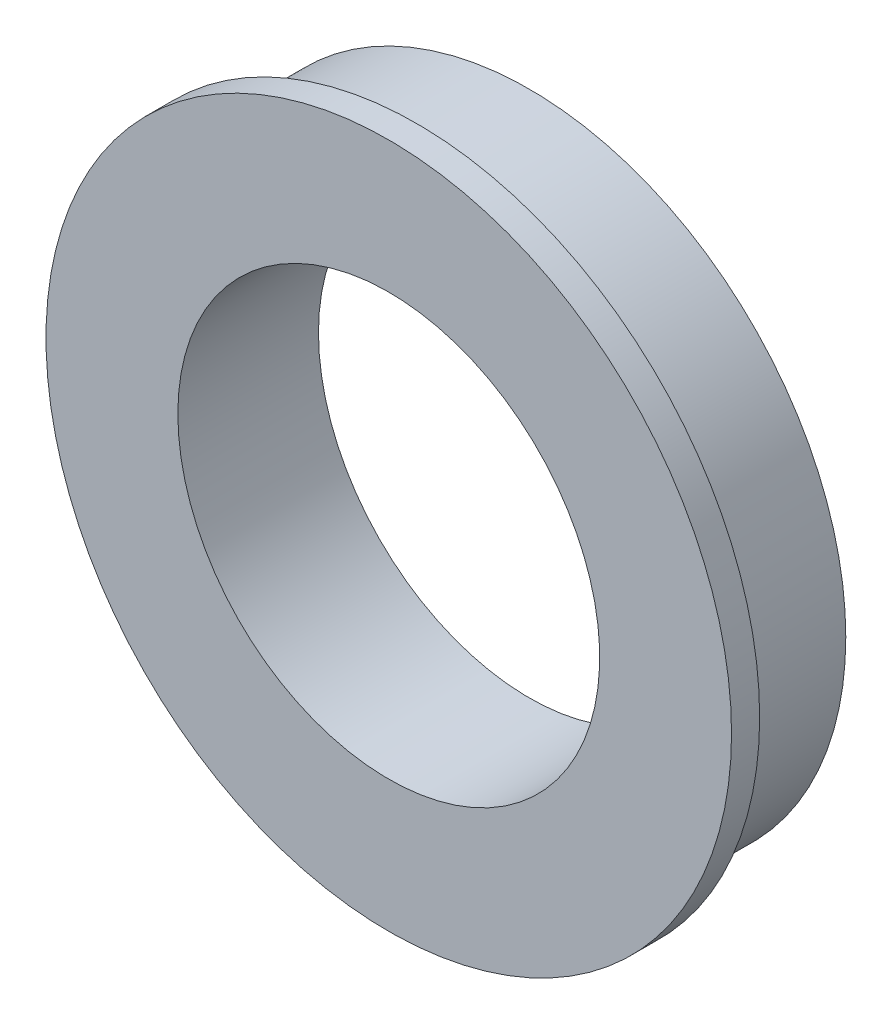
ISO-10303-21;
HEADER;
FILE_DESCRIPTION(('STEP AP214'),'2;1');
FILE_NAME('part.step','',(''),(''),'','','');
FILE_SCHEMA(('AUTOMOTIVE_DESIGN { 1 0 10303 214 1 1 1 1 }'));
ENDSEC;
DATA;
#1=APPLICATION_CONTEXT('core data for automotive mechanical design processes');
#2=APPLICATION_PROTOCOL_DEFINITION('international standard','automotive_design',2000,#1);
#3=PRODUCT_CONTEXT('',#1,'mechanical');
#4=PRODUCT('Part','Part','',(#3));
#5=PRODUCT_RELATED_PRODUCT_CATEGORY('part','',(#4));
#6=PRODUCT_DEFINITION_FORMATION('','',#4);
#7=PRODUCT_DEFINITION_CONTEXT('part definition',#1,'design');
#8=PRODUCT_DEFINITION('design','',#6,#7);
#9=PRODUCT_DEFINITION_SHAPE('','',#8);
#10=(LENGTH_UNIT() NAMED_UNIT(*) SI_UNIT(.MILLI.,.METRE.));
#11=(NAMED_UNIT(*) PLANE_ANGLE_UNIT() SI_UNIT($,.RADIAN.));
#12=(NAMED_UNIT(*) SI_UNIT($,.STERADIAN.) SOLID_ANGLE_UNIT());
#13=UNCERTAINTY_MEASURE_WITH_UNIT(LENGTH_MEASURE(1.E-05),#10,'distance_accuracy_value','');
#14=(GEOMETRIC_REPRESENTATION_CONTEXT(3) GLOBAL_UNCERTAINTY_ASSIGNED_CONTEXT((#13)) GLOBAL_UNIT_ASSIGNED_CONTEXT((#10,
#11,#12)) REPRESENTATION_CONTEXT('',''));
#15=CARTESIAN_POINT('',(0.,0.,0.));
#16=DIRECTION('',(0.,0.,1.));
#17=DIRECTION('',(1.,0.,0.));
#18=AXIS2_PLACEMENT_3D('',#15,#16,#17);
#19=CARTESIAN_POINT('',(0.,0.,4.));
#20=DIRECTION('',(0.,0.,-1.));
#21=DIRECTION('',(-1.,0.,0.));
#22=AXIS2_PLACEMENT_3D('',#19,#20,#21);
#23=CYLINDRICAL_SURFACE('',#22,9.);
#24=CARTESIAN_POINT('',(0.,0.,0.));
#25=DIRECTION('',(0.,0.,1.));
#26=DIRECTION('',(1.,0.,0.));
#27=AXIS2_PLACEMENT_3D('',#24,#25,#26);
#28=CIRCLE('',#27,9.);
#29=CARTESIAN_POINT('',(9.,0.,0.));
#30=VERTEX_POINT('',#29);
#31=EDGE_CURVE('E38',#30,#30,#28,.T.);
#32=ORIENTED_EDGE('',*,*,#31,.T.);
#33=EDGE_LOOP('',(#32));
#34=FACE_BOUND('',#33,.T.);
#35=CARTESIAN_POINT('',(0.,0.,3.2));
#36=DIRECTION('',(0.,0.,1.));
#37=DIRECTION('',(1.,0.,0.));
#38=AXIS2_PLACEMENT_3D('',#35,#36,#37);
#39=CIRCLE('',#38,9.);
#40=CARTESIAN_POINT('',(9.,0.,3.2));
#41=VERTEX_POINT('',#40);
#42=EDGE_CURVE('E10',#41,#41,#39,.T.);
#43=ORIENTED_EDGE('',*,*,#42,.F.);
#44=EDGE_LOOP('',(#43));
#45=FACE_BOUND('',#44,.T.);
#46=ADVANCED_FACE('F32',(#34,#45),#23,.T.);
#47=CARTESIAN_POINT('',(0.,0.,0.));
#48=DIRECTION('',(0.,0.,1.));
#49=DIRECTION('',(1.,0.,0.));
#50=AXIS2_PLACEMENT_3D('',#47,#48,#49);
#51=PLANE('',#50);
#52=CARTESIAN_POINT('',(0.,0.,0.));
#53=DIRECTION('',(0.,0.,-1.));
#54=DIRECTION('',(-1.,0.,0.));
#55=AXIS2_PLACEMENT_3D('',#52,#53,#54);
#56=CIRCLE('',#55,6.);
#57=CARTESIAN_POINT('',(-6.,0.,0.));
#58=VERTEX_POINT('',#57);
#59=EDGE_CURVE('E52',#58,#58,#56,.T.);
#60=ORIENTED_EDGE('',*,*,#59,.F.);
#61=EDGE_LOOP('',(#60));
#62=FACE_BOUND('',#61,.T.);
#63=ORIENTED_EDGE('',*,*,#31,.F.);
#64=EDGE_LOOP('',(#63));
#65=FACE_BOUND('',#64,.T.);
#66=ADVANCED_FACE('F67',(#62,#65),#51,.F.);
#67=CARTESIAN_POINT('',(0.,0.,3.2));
#68=DIRECTION('',(0.,0.,1.));
#69=DIRECTION('',(1.,0.,0.));
#70=AXIS2_PLACEMENT_3D('',#67,#68,#69);
#71=CYLINDRICAL_SURFACE('',#70,9.75);
#72=CARTESIAN_POINT('',(0.,0.,3.2));
#73=DIRECTION('',(0.,0.,1.));
#74=DIRECTION('',(1.,0.,0.));
#75=AXIS2_PLACEMENT_3D('',#72,#73,#74);
#76=CIRCLE('',#75,9.75);
#77=CARTESIAN_POINT('',(9.75,0.,3.2));
#78=VERTEX_POINT('',#77);
#79=EDGE_CURVE('E42',#78,#78,#76,.T.);
#80=ORIENTED_EDGE('',*,*,#79,.T.);
#81=EDGE_LOOP('',(#80));
#82=FACE_BOUND('',#81,.T.);
#83=CARTESIAN_POINT('',(0.,0.,4.));
#84=DIRECTION('',(0.,0.,1.));
#85=DIRECTION('',(1.,0.,0.));
#86=AXIS2_PLACEMENT_3D('',#83,#84,#85);
#87=CIRCLE('',#86,9.75);
#88=CARTESIAN_POINT('',(9.75,0.,4.));
#89=VERTEX_POINT('',#88);
#90=EDGE_CURVE('E46',#89,#89,#87,.T.);
#91=ORIENTED_EDGE('',*,*,#90,.F.);
#92=EDGE_LOOP('',(#91));
#93=FACE_BOUND('',#92,.T.);
#94=ADVANCED_FACE('F70',(#82,#93),#71,.T.);
#95=CARTESIAN_POINT('',(0.,0.,3.2));
#96=DIRECTION('',(0.,0.,1.));
#97=DIRECTION('',(1.,0.,0.));
#98=AXIS2_PLACEMENT_3D('',#95,#96,#97);
#99=PLANE('',#98);
#100=ORIENTED_EDGE('',*,*,#42,.T.);
#101=EDGE_LOOP('',(#100));
#102=FACE_BOUND('',#101,.T.);
#103=ORIENTED_EDGE('',*,*,#79,.F.);
#104=EDGE_LOOP('',(#103));
#105=FACE_BOUND('',#104,.T.);
#106=ADVANCED_FACE('F75',(#102,#105),#99,.F.);
#107=CARTESIAN_POINT('',(0.,0.,4.));
#108=DIRECTION('',(0.,0.,1.));
#109=DIRECTION('',(1.,0.,0.));
#110=AXIS2_PLACEMENT_3D('',#107,#108,#109);
#111=PLANE('',#110);
#112=CARTESIAN_POINT('',(0.,0.,4.));
#113=DIRECTION('',(0.,0.,-1.));
#114=DIRECTION('',(-1.,0.,0.));
#115=AXIS2_PLACEMENT_3D('',#112,#113,#114);
#116=CIRCLE('',#115,6.);
#117=CARTESIAN_POINT('',(-6.,0.,4.));
#118=VERTEX_POINT('',#117);
#119=EDGE_CURVE('E50',#118,#118,#116,.T.);
#120=ORIENTED_EDGE('',*,*,#119,.T.);
#121=EDGE_LOOP('',(#120));
#122=FACE_BOUND('',#121,.T.);
#123=ORIENTED_EDGE('',*,*,#90,.T.);
#124=EDGE_LOOP('',(#123));
#125=FACE_BOUND('',#124,.T.);
#126=ADVANCED_FACE('F58',(#122,#125),#111,.T.);
#127=CARTESIAN_POINT('',(0.,0.,4.));
#128=DIRECTION('',(0.,0.,-1.));
#129=DIRECTION('',(-1.,0.,0.));
#130=AXIS2_PLACEMENT_3D('',#127,#128,#129);
#131=CYLINDRICAL_SURFACE('',#130,6.);
#132=ORIENTED_EDGE('',*,*,#119,.F.);
#133=EDGE_LOOP('',(#132));
#134=FACE_BOUND('',#133,.T.);
#135=ORIENTED_EDGE('',*,*,#59,.T.);
#136=EDGE_LOOP('',(#135));
#137=FACE_BOUND('',#136,.T.);
#138=ADVANCED_FACE('F61',(#134,#137),#131,.F.);
#139=CLOSED_SHELL('',(#46,#66,#94,#106,#126,#138));
#140=MANIFOLD_SOLID_BREP('B2',#139);
#141=ADVANCED_BREP_SHAPE_REPRESENTATION('',(#18,#140),#14);
#142=SHAPE_DEFINITION_REPRESENTATION(#9,#141);
ENDSEC;
END-ISO-10303-21;
